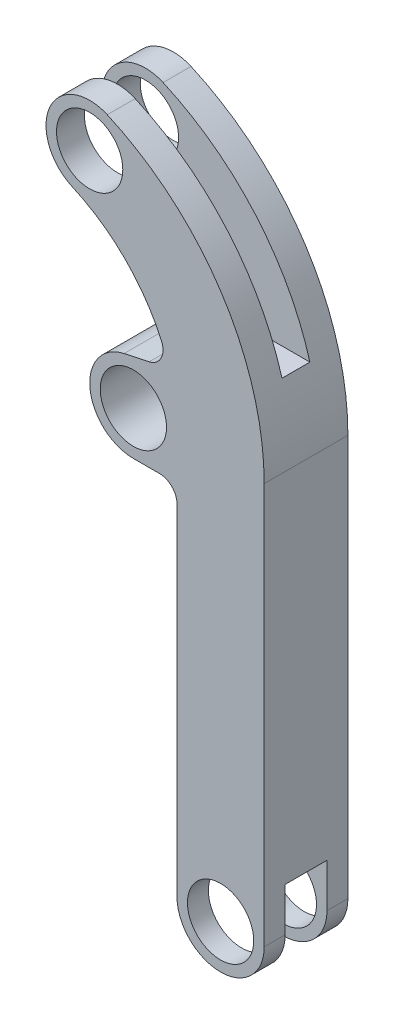
ISO-10303-21;
HEADER;
FILE_DESCRIPTION(('STEP AP214'),'2;1');
FILE_NAME('part.step','',(''),(''),'','','');
FILE_SCHEMA(('AUTOMOTIVE_DESIGN { 1 0 10303 214 1 1 1 1 }'));
ENDSEC;
DATA;
#1=APPLICATION_CONTEXT('core data for automotive mechanical design processes');
#2=APPLICATION_PROTOCOL_DEFINITION('international standard','automotive_design',2000,#1);
#3=PRODUCT_CONTEXT('',#1,'mechanical');
#4=PRODUCT('Part','Part','',(#3));
#5=PRODUCT_RELATED_PRODUCT_CATEGORY('part','',(#4));
#6=PRODUCT_DEFINITION_FORMATION('','',#4);
#7=PRODUCT_DEFINITION_CONTEXT('part definition',#1,'design');
#8=PRODUCT_DEFINITION('design','',#6,#7);
#9=PRODUCT_DEFINITION_SHAPE('','',#8);
#10=(LENGTH_UNIT() NAMED_UNIT(*) SI_UNIT(.MILLI.,.METRE.));
#11=(NAMED_UNIT(*) PLANE_ANGLE_UNIT() SI_UNIT($,.RADIAN.));
#12=(NAMED_UNIT(*) SI_UNIT($,.STERADIAN.) SOLID_ANGLE_UNIT());
#13=UNCERTAINTY_MEASURE_WITH_UNIT(LENGTH_MEASURE(1.E-05),#10,'distance_accuracy_value','');
#14=(GEOMETRIC_REPRESENTATION_CONTEXT(3) GLOBAL_UNCERTAINTY_ASSIGNED_CONTEXT((#13)) GLOBAL_UNIT_ASSIGNED_CONTEXT((#10,
#11,#12)) REPRESENTATION_CONTEXT('',''));
#15=CARTESIAN_POINT('',(0.,0.,0.));
#16=DIRECTION('',(0.,0.,1.));
#17=DIRECTION('',(1.,0.,0.));
#18=AXIS2_PLACEMENT_3D('',#15,#16,#17);
#19=CARTESIAN_POINT('',(0.,0.,24.));
#20=DIRECTION('',(0.,0.,-1.));
#21=DIRECTION('',(-1.,0.,0.));
#22=AXIS2_PLACEMENT_3D('',#19,#20,#21);
#23=CYLINDRICAL_SURFACE('',#22,12.5);
#24=DIRECTION('',(0.,0.,-1.));
#25=VECTOR('',#24,1.);
#26=CARTESIAN_POINT('',(-12.5,0.,24.));
#27=LINE('',#26,#25);
#28=CARTESIAN_POINT('',(-12.5,0.,24.));
#29=VERTEX_POINT('',#28);
#30=CARTESIAN_POINT('',(-12.5,0.,18.));
#31=VERTEX_POINT('',#30);
#32=EDGE_CURVE('E334',#29,#31,#27,.T.);
#33=ORIENTED_EDGE('',*,*,#32,.T.);
#34=CARTESIAN_POINT('',(0.,0.,18.));
#35=DIRECTION('',(0.,0.,1.));
#36=DIRECTION('',(1.,0.,0.));
#37=AXIS2_PLACEMENT_3D('',#34,#35,#36);
#38=CIRCLE('',#37,12.5);
#39=CARTESIAN_POINT('',(12.5000000016546,0.,18.));
#40=VERTEX_POINT('',#39);
#41=EDGE_CURVE('E220',#31,#40,#38,.T.);
#42=ORIENTED_EDGE('',*,*,#41,.T.);
#43=DIRECTION('',(0.,0.,-1.));
#44=VECTOR('',#43,1.);
#45=CARTESIAN_POINT('',(12.5,0.,24.));
#46=LINE('',#45,#44);
#47=CARTESIAN_POINT('',(12.5,0.,24.));
#48=VERTEX_POINT('',#47);
#49=EDGE_CURVE('E330',#48,#40,#46,.T.);
#50=ORIENTED_EDGE('',*,*,#49,.F.);
#51=CARTESIAN_POINT('',(0.,0.,24.));
#52=DIRECTION('',(0.,0.,1.));
#53=DIRECTION('',(1.,0.,0.));
#54=AXIS2_PLACEMENT_3D('',#51,#52,#53);
#55=CIRCLE('',#54,12.5);
#56=EDGE_CURVE('E275',#29,#48,#55,.T.);
#57=ORIENTED_EDGE('',*,*,#56,.F.);
#58=EDGE_LOOP('',(#33,#42,#50,#57));
#59=FACE_BOUND('',#58,.T.);
#60=ADVANCED_FACE('F35',(#59),#23,.T.);
#61=CARTESIAN_POINT('',(0.,0.,24.));
#62=DIRECTION('',(0.,0.,-1.));
#63=DIRECTION('',(-1.,0.,0.));
#64=AXIS2_PLACEMENT_3D('',#61,#62,#63);
#65=CYLINDRICAL_SURFACE('',#64,9.5);
#66=CARTESIAN_POINT('',(0.,0.,18.));
#67=DIRECTION('',(0.,0.,1.));
#68=DIRECTION('',(1.,0.,0.));
#69=AXIS2_PLACEMENT_3D('',#66,#67,#68);
#70=CIRCLE('',#69,9.5);
#71=CARTESIAN_POINT('',(9.50000000000001,0.,18.));
#72=VERTEX_POINT('',#71);
#73=EDGE_CURVE('E217',#72,#72,#70,.T.);
#74=ORIENTED_EDGE('',*,*,#73,.F.);
#75=EDGE_LOOP('',(#74));
#76=FACE_BOUND('',#75,.T.);
#77=CARTESIAN_POINT('',(0.,0.,24.));
#78=DIRECTION('',(0.,0.,1.));
#79=DIRECTION('',(1.,0.,0.));
#80=AXIS2_PLACEMENT_3D('',#77,#78,#79);
#81=CIRCLE('',#80,9.5);
#82=CARTESIAN_POINT('',(9.50000000000001,0.,24.));
#83=VERTEX_POINT('',#82);
#84=EDGE_CURVE('E282',#83,#83,#81,.T.);
#85=ORIENTED_EDGE('',*,*,#84,.T.);
#86=EDGE_LOOP('',(#85));
#87=FACE_BOUND('',#86,.T.);
#88=ADVANCED_FACE('F459',(#76,#87),#65,.F.);
#89=CARTESIAN_POINT('',(-37.5333490155316,172.653405471445,24.));
#90=DIRECTION('',(0.,0.,-1.));
#91=DIRECTION('',(-1.,0.,0.));
#92=AXIS2_PLACEMENT_3D('',#89,#90,#91);
#93=CYLINDRICAL_SURFACE('',#92,12.5);
#94=CARTESIAN_POINT('',(-37.5333490155316,172.653405471445,16.));
#95=DIRECTION('',(0.,0.,1.));
#96=DIRECTION('',(0.,-1.,0.));
#97=AXIS2_PLACEMENT_3D('',#94,#95,#96);
#98=CIRCLE('',#97,12.5);
#99=CARTESIAN_POINT('',(-32.4750796285068,184.084237060104,16.));
#100=VERTEX_POINT('',#99);
#101=CARTESIAN_POINT('',(-42.5916184025563,161.222573882786,16.));
#102=VERTEX_POINT('',#101);
#103=EDGE_CURVE('E234',#100,#102,#98,.T.);
#104=ORIENTED_EDGE('',*,*,#103,.T.);
#105=DIRECTION('',(0.,0.,-1.));
#106=VECTOR('',#105,1.);
#107=CARTESIAN_POINT('',(-42.5916184025563,161.222573882786,24.));
#108=LINE('',#107,#106);
#109=CARTESIAN_POINT('',(-42.5916184025563,161.222573882786,24.));
#110=VERTEX_POINT('',#109);
#111=EDGE_CURVE('E354',#110,#102,#108,.T.);
#112=ORIENTED_EDGE('',*,*,#111,.F.);
#113=CARTESIAN_POINT('',(-37.5333490155316,172.653405471445,24.));
#114=DIRECTION('',(0.,0.,1.));
#115=DIRECTION('',(1.,0.,0.));
#116=AXIS2_PLACEMENT_3D('',#113,#114,#115);
#117=CIRCLE('',#116,12.5);
#118=CARTESIAN_POINT('',(-32.4750796285068,184.084237060104,24.));
#119=VERTEX_POINT('',#118);
#120=EDGE_CURVE('E254',#119,#110,#117,.T.);
#121=ORIENTED_EDGE('',*,*,#120,.F.);
#122=DIRECTION('',(0.,0.,-1.));
#123=VECTOR('',#122,1.);
#124=CARTESIAN_POINT('',(-32.4750796285068,184.084237060104,24.));
#125=LINE('',#124,#123);
#126=EDGE_CURVE('E358',#119,#100,#125,.T.);
#127=ORIENTED_EDGE('',*,*,#126,.T.);
#128=EDGE_LOOP('',(#104,#112,#121,#127));
#129=FACE_BOUND('',#128,.T.);
#130=ADVANCED_FACE('F464',(#129),#93,.T.);
#131=CARTESIAN_POINT('',(-63.0453972473131,115.0005,24.));
#132=DIRECTION('',(0.,0.,-1.));
#133=DIRECTION('',(-1.,0.,0.));
#134=AXIS2_PLACEMENT_3D('',#131,#132,#133);
#135=CYLINDRICAL_SURFACE('',#134,50.5453972489678);
#136=CARTESIAN_POINT('',(-63.0453972473131,115.0005,8.00000000000001));
#137=DIRECTION('',(0.,0.,-1.));
#138=DIRECTION('',(0.,1.,0.));
#139=AXIS2_PLACEMENT_3D('',#136,#137,#138);
#140=CIRCLE('',#139,50.5453972489678);
#141=CARTESIAN_POINT('',(-42.5916184025563,161.222573882786,8.));
#142=VERTEX_POINT('',#141);
#143=CARTESIAN_POINT('',(-16.9412221405557,135.718661616838,8.00000000000001));
#144=VERTEX_POINT('',#143);
#145=EDGE_CURVE('E240',#142,#144,#140,.T.);
#146=ORIENTED_EDGE('',*,*,#145,.F.);
#147=CARTESIAN_POINT('',(-42.5916184025563,161.222573882786,0.));
#148=VERTEX_POINT('',#147);
#149=EDGE_CURVE('E352',#142,#148,#108,.T.);
#150=ORIENTED_EDGE('',*,*,#149,.T.);
#151=CARTESIAN_POINT('',(-63.0453972473131,115.0005,0.));
#152=DIRECTION('',(0.,0.,1.));
#153=DIRECTION('',(1.,0.,0.));
#154=AXIS2_PLACEMENT_3D('',#151,#152,#153);
#155=CIRCLE('',#154,50.5453972489678);
#156=CARTESIAN_POINT('',(-16.9412221405557,135.718661616838,0.));
#157=VERTEX_POINT('',#156);
#158=EDGE_CURVE('E294',#157,#148,#155,.T.);
#159=ORIENTED_EDGE('',*,*,#158,.F.);
#160=DIRECTION('',(0.,0.,-1.));
#161=VECTOR('',#160,1.);
#162=CARTESIAN_POINT('',(-16.9412221405557,135.718661616838,24.));
#163=LINE('',#162,#161);
#164=EDGE_CURVE('E348',#144,#157,#163,.T.);
#165=ORIENTED_EDGE('',*,*,#164,.F.);
#166=EDGE_LOOP('',(#146,#150,#159,#165));
#167=FACE_BOUND('',#166,.T.);
#168=ADVANCED_FACE('F431',(#167),#135,.F.);
#169=CARTESIAN_POINT('',(-37.5333490155316,172.653405471445,24.));
#170=DIRECTION('',(0.,0.,-1.));
#171=DIRECTION('',(-1.,0.,0.));
#172=AXIS2_PLACEMENT_3D('',#169,#170,#171);
#173=CYLINDRICAL_SURFACE('',#172,9.50000000000001);
#174=CARTESIAN_POINT('',(-37.5333490155316,172.653405471445,8.));
#175=DIRECTION('',(0.,0.,-1.));
#176=DIRECTION('',(0.,1.,0.));
#177=AXIS2_PLACEMENT_3D('',#174,#175,#176);
#178=CIRCLE('',#177,9.50000000000001);
#179=CARTESIAN_POINT('',(-37.5333490155316,182.153405471445,8.));
#180=VERTEX_POINT('',#179);
#181=EDGE_CURVE('E239',#180,#180,#178,.T.);
#182=ORIENTED_EDGE('',*,*,#181,.F.);
#183=EDGE_LOOP('',(#182));
#184=FACE_BOUND('',#183,.T.);
#185=CARTESIAN_POINT('',(-37.5333490155316,172.653405471445,0.));
#186=DIRECTION('',(0.,0.,1.));
#187=DIRECTION('',(1.,0.,0.));
#188=AXIS2_PLACEMENT_3D('',#185,#186,#187);
#189=CIRCLE('',#188,9.50000000000001);
#190=CARTESIAN_POINT('',(-28.0333490155316,172.653405471445,0.));
#191=VERTEX_POINT('',#190);
#192=EDGE_CURVE('E319',#191,#191,#189,.T.);
#193=ORIENTED_EDGE('',*,*,#192,.F.);
#194=EDGE_LOOP('',(#193));
#195=FACE_BOUND('',#194,.T.);
#196=ADVANCED_FACE('F542',(#184,#195),#173,.F.);
#197=CARTESIAN_POINT('',(-63.0453972473131,115.0005,24.));
#198=DIRECTION('',(0.,0.,-1.));
#199=DIRECTION('',(-1.,0.,0.));
#200=AXIS2_PLACEMENT_3D('',#197,#198,#199);
#201=CYLINDRICAL_SURFACE('',#200,75.5453972489677);
#202=CARTESIAN_POINT('',(-32.4750796285068,184.084237060104,8.));
#203=VERTEX_POINT('',#202);
#204=CARTESIAN_POINT('',(-32.4750796285068,184.084237060104,0.));
#205=VERTEX_POINT('',#204);
#206=EDGE_CURVE('E357',#203,#205,#125,.T.);
#207=ORIENTED_EDGE('',*,*,#206,.F.);
#208=CARTESIAN_POINT('',(-63.0453972473131,115.0005,8.00000000000001));
#209=DIRECTION('',(0.,0.,-1.));
#210=DIRECTION('',(0.,1.,0.));
#211=AXIS2_PLACEMENT_3D('',#208,#209,#210);
#212=CIRCLE('',#211,75.5453972489677);
#213=CARTESIAN_POINT('',(9.60351757405861,135.718661616838,8.00000000000001));
#214=VERTEX_POINT('',#213);
#215=EDGE_CURVE('E244',#203,#214,#212,.T.);
#216=ORIENTED_EDGE('',*,*,#215,.T.);
#217=DIRECTION('',(0.,0.,-1.));
#218=VECTOR('',#217,1.);
#219=CARTESIAN_POINT('',(9.60351757405861,135.718661616838,24.));
#220=LINE('',#219,#218);
#221=CARTESIAN_POINT('',(9.60351757405861,135.718661616838,16.));
#222=VERTEX_POINT('',#221);
#223=EDGE_CURVE('E247',#214,#222,#220,.F.);
#224=ORIENTED_EDGE('',*,*,#223,.T.);
#225=CARTESIAN_POINT('',(-63.0453972473131,115.0005,16.));
#226=DIRECTION('',(0.,0.,1.));
#227=DIRECTION('',(0.,-1.,0.));
#228=AXIS2_PLACEMENT_3D('',#225,#226,#227);
#229=CIRCLE('',#228,75.5453972489677);
#230=EDGE_CURVE('E236',#222,#100,#229,.T.);
#231=ORIENTED_EDGE('',*,*,#230,.T.);
#232=ORIENTED_EDGE('',*,*,#126,.F.);
#233=CARTESIAN_POINT('',(-63.0453972473131,115.0005,24.));
#234=DIRECTION('',(0.,0.,1.));
#235=DIRECTION('',(1.,0.,0.));
#236=AXIS2_PLACEMENT_3D('',#233,#234,#235);
#237=CIRCLE('',#236,75.5453972489677);
#238=CARTESIAN_POINT('',(12.5,115.,24.));
#239=VERTEX_POINT('',#238);
#240=EDGE_CURVE('E251',#239,#119,#237,.T.);
#241=ORIENTED_EDGE('',*,*,#240,.F.);
#242=DIRECTION('',(0.,0.,-1.));
#243=VECTOR('',#242,1.);
#244=CARTESIAN_POINT('',(12.5,115.,24.));
#245=LINE('',#244,#243);
#246=CARTESIAN_POINT('',(12.5,115.,0.));
#247=VERTEX_POINT('',#246);
#248=EDGE_CURVE('E288',#239,#247,#245,.T.);
#249=ORIENTED_EDGE('',*,*,#248,.T.);
#250=CARTESIAN_POINT('',(-63.0453972473131,115.0005,0.));
#251=DIRECTION('',(0.,0.,1.));
#252=DIRECTION('',(1.,0.,0.));
#253=AXIS2_PLACEMENT_3D('',#250,#251,#252);
#254=CIRCLE('',#253,75.5453972489677);
#255=EDGE_CURVE('E250',#247,#205,#254,.T.);
#256=ORIENTED_EDGE('',*,*,#255,.T.);
#257=EDGE_LOOP('',(#207,#216,#224,#231,#232,#241,#249,#256));
#258=FACE_BOUND('',#257,.T.);
#259=ADVANCED_FACE('F37',(#258),#201,.T.);
#260=ORIENTED_EDGE('',*,*,#149,.F.);
#261=CARTESIAN_POINT('',(-37.5333490155316,172.653405471445,8.));
#262=DIRECTION('',(0.,0.,-1.));
#263=DIRECTION('',(0.,1.,0.));
#264=AXIS2_PLACEMENT_3D('',#261,#262,#263);
#265=CIRCLE('',#264,12.5);
#266=EDGE_CURVE('E242',#142,#203,#265,.T.);
#267=ORIENTED_EDGE('',*,*,#266,.T.);
#268=ORIENTED_EDGE('',*,*,#206,.T.);
#269=CARTESIAN_POINT('',(-37.5333490155316,172.653405471445,0.));
#270=DIRECTION('',(0.,0.,1.));
#271=DIRECTION('',(1.,0.,0.));
#272=AXIS2_PLACEMENT_3D('',#269,#270,#271);
#273=CIRCLE('',#272,12.5);
#274=EDGE_CURVE('E291',#205,#148,#273,.T.);
#275=ORIENTED_EDGE('',*,*,#274,.T.);
#276=EDGE_LOOP('',(#260,#267,#268,#275));
#277=FACE_BOUND('',#276,.T.);
#278=ADVANCED_FACE('F435',(#277),#93,.T.);
#279=CARTESIAN_POINT('',(-63.0453972473131,115.0005,16.));
#280=DIRECTION('',(0.,0.,1.));
#281=DIRECTION('',(0.,-1.,0.));
#282=AXIS2_PLACEMENT_3D('',#279,#280,#281);
#283=CIRCLE('',#282,50.5453972489678);
#284=CARTESIAN_POINT('',(-16.9412221405557,135.718661616838,16.));
#285=VERTEX_POINT('',#284);
#286=EDGE_CURVE('E231',#285,#102,#283,.T.);
#287=ORIENTED_EDGE('',*,*,#286,.F.);
#288=CARTESIAN_POINT('',(-16.9412221405557,135.718661616838,24.));
#289=VERTEX_POINT('',#288);
#290=EDGE_CURVE('E349',#289,#285,#163,.T.);
#291=ORIENTED_EDGE('',*,*,#290,.F.);
#292=CARTESIAN_POINT('',(-63.0453972473131,115.0005,24.));
#293=DIRECTION('',(0.,0.,1.));
#294=DIRECTION('',(1.,0.,0.));
#295=AXIS2_PLACEMENT_3D('',#292,#293,#294);
#296=CIRCLE('',#295,50.5453972489678);
#297=EDGE_CURVE('E257',#289,#110,#296,.T.);
#298=ORIENTED_EDGE('',*,*,#297,.T.);
#299=ORIENTED_EDGE('',*,*,#111,.T.);
#300=EDGE_LOOP('',(#287,#291,#298,#299));
#301=FACE_BOUND('',#300,.T.);
#302=ADVANCED_FACE('F447',(#301),#135,.F.);
#303=CARTESIAN_POINT('',(-21.5018921140911,133.669200860323,24.));
#304=DIRECTION('',(0.,0.,-1.));
#305=DIRECTION('',(-1.,0.,0.));
#306=AXIS2_PLACEMENT_3D('',#303,#304,#305);
#307=CYLINDRICAL_SURFACE('',#306,5.00000000000001);
#308=CARTESIAN_POINT('',(-21.5018921140911,133.669200860323,0.));
#309=DIRECTION('',(0.,0.,1.));
#310=DIRECTION('',(1.,0.,0.));
#311=AXIS2_PLACEMENT_3D('',#308,#309,#310);
#312=CIRCLE('',#311,5.00000000000001);
#313=CARTESIAN_POINT('',(-20.4397438924359,128.783319040709,0.));
#314=VERTEX_POINT('',#313);
#315=EDGE_CURVE('E297',#157,#314,#312,.F.);
#316=ORIENTED_EDGE('',*,*,#315,.T.);
#317=DIRECTION('',(0.,0.,-1.));
#318=VECTOR('',#317,1.);
#319=CARTESIAN_POINT('',(-20.4397438924359,128.783319040709,24.));
#320=LINE('',#319,#318);
#321=CARTESIAN_POINT('',(-20.4397438924359,128.783319040709,24.));
#322=VERTEX_POINT('',#321);
#323=EDGE_CURVE('E346',#322,#314,#320,.T.);
#324=ORIENTED_EDGE('',*,*,#323,.F.);
#325=CARTESIAN_POINT('',(-21.5018921140911,133.669200860323,24.));
#326=DIRECTION('',(0.,0.,1.));
#327=DIRECTION('',(1.,0.,0.));
#328=AXIS2_PLACEMENT_3D('',#325,#326,#327);
#329=CIRCLE('',#328,5.00000000000001);
#330=EDGE_CURVE('E260',#289,#322,#329,.F.);
#331=ORIENTED_EDGE('',*,*,#330,.F.);
#332=ORIENTED_EDGE('',*,*,#290,.T.);
#333=EDGE_CURVE('E353',#285,#144,#163,.T.);
#334=ORIENTED_EDGE('',*,*,#333,.T.);
#335=ORIENTED_EDGE('',*,*,#164,.T.);
#336=EDGE_LOOP('',(#316,#324,#331,#332,#334,#335));
#337=FACE_BOUND('',#336,.T.);
#338=ADVANCED_FACE('F449',(#337),#307,.F.);
#339=CARTESIAN_POINT('',(-27.6553705541378,127.214704549035,24.));
#340=DIRECTION('',(-0.212429644331042,0.977176363922801,0.));
#341=DIRECTION('',(-0.977176363922801,-0.212429644331042,0.));
#342=AXIS2_PLACEMENT_3D('',#339,#340,#341);
#343=PLANE('',#342);
#344=DIRECTION('',(0.977176363922801,0.212429644331042,0.));
#345=VECTOR('',#344,1.);
#346=CARTESIAN_POINT('',(-27.6553705541378,127.214704549035,0.));
#347=LINE('',#346,#345);
#348=CARTESIAN_POINT('',(-27.655370554138,127.214704549035,0.));
#349=VERTEX_POINT('',#348);
#350=EDGE_CURVE('E300',#349,#314,#347,.T.);
#351=ORIENTED_EDGE('',*,*,#350,.F.);
#352=DIRECTION('',(0.,0.,-1.));
#353=VECTOR('',#352,1.);
#354=CARTESIAN_POINT('',(-27.655370554138,127.214704549035,24.));
#355=LINE('',#354,#353);
#356=CARTESIAN_POINT('',(-27.655370554138,127.214704549035,24.));
#357=VERTEX_POINT('',#356);
#358=EDGE_CURVE('E344',#357,#349,#355,.T.);
#359=ORIENTED_EDGE('',*,*,#358,.F.);
#360=DIRECTION('',(0.977176363922801,0.212429644331042,0.));
#361=VECTOR('',#360,1.);
#362=CARTESIAN_POINT('',(-27.6553705541378,127.214704549035,24.));
#363=LINE('',#362,#361);
#364=EDGE_CURVE('E262',#357,#322,#363,.T.);
#365=ORIENTED_EDGE('',*,*,#364,.T.);
#366=ORIENTED_EDGE('',*,*,#323,.T.);
#367=EDGE_LOOP('',(#351,#359,#365,#366));
#368=FACE_BOUND('',#367,.T.);
#369=ADVANCED_FACE('F423',(#368),#343,.T.);
#370=CARTESIAN_POINT('',(-25.,115.,24.));
#371=DIRECTION('',(0.,0.,-1.));
#372=DIRECTION('',(-1.,0.,0.));
#373=AXIS2_PLACEMENT_3D('',#370,#371,#372);
#374=CYLINDRICAL_SURFACE('',#373,12.5);
#375=DIRECTION('',(0.,0.,-1.));
#376=VECTOR('',#375,1.);
#377=CARTESIAN_POINT('',(-35.5,108.217670016875,24.));
#378=LINE('',#377,#376);
#379=CARTESIAN_POINT('',(-35.5,108.217670016875,16.));
#380=VERTEX_POINT('',#379);
#381=CARTESIAN_POINT('',(-35.5,108.217670016875,8.));
#382=VERTEX_POINT('',#381);
#383=EDGE_CURVE('E186',#380,#382,#378,.T.);
#384=ORIENTED_EDGE('',*,*,#383,.T.);
#385=CARTESIAN_POINT('',(-25.,115.,8.));
#386=DIRECTION('',(0.,0.,-1.));
#387=DIRECTION('',(-1.,0.,0.));
#388=AXIS2_PLACEMENT_3D('',#385,#386,#387);
#389=CIRCLE('',#388,12.5);
#390=CARTESIAN_POINT('',(-35.5,121.782329983125,8.));
#391=VERTEX_POINT('',#390);
#392=EDGE_CURVE('E11',#382,#391,#389,.T.);
#393=ORIENTED_EDGE('',*,*,#392,.T.);
#394=DIRECTION('',(0.,0.,-1.));
#395=VECTOR('',#394,1.);
#396=CARTESIAN_POINT('',(-35.5,121.782329983125,24.));
#397=LINE('',#396,#395);
#398=CARTESIAN_POINT('',(-35.5,121.782329983125,16.));
#399=VERTEX_POINT('',#398);
#400=EDGE_CURVE('E188',#391,#399,#397,.F.);
#401=ORIENTED_EDGE('',*,*,#400,.T.);
#402=CARTESIAN_POINT('',(-25.,115.,16.));
#403=DIRECTION('',(0.,0.,1.));
#404=DIRECTION('',(1.,0.,0.));
#405=AXIS2_PLACEMENT_3D('',#402,#403,#404);
#406=CIRCLE('',#405,12.5);
#407=EDGE_CURVE('E192',#399,#380,#406,.T.);
#408=ORIENTED_EDGE('',*,*,#407,.T.);
#409=EDGE_LOOP('',(#384,#393,#401,#408));
#410=FACE_BOUND('',#409,.T.);
#411=CARTESIAN_POINT('',(-25.,115.,0.));
#412=DIRECTION('',(0.,0.,1.));
#413=DIRECTION('',(1.,0.,0.));
#414=AXIS2_PLACEMENT_3D('',#411,#412,#413);
#415=CIRCLE('',#414,12.5);
#416=CARTESIAN_POINT('',(-25.,102.5,0.));
#417=VERTEX_POINT('',#416);
#418=EDGE_CURVE('E303',#349,#417,#415,.T.);
#419=ORIENTED_EDGE('',*,*,#418,.T.);
#420=DIRECTION('',(0.,0.,-1.));
#421=VECTOR('',#420,1.);
#422=CARTESIAN_POINT('',(-25.,102.5,24.));
#423=LINE('',#422,#421);
#424=CARTESIAN_POINT('',(-25.,102.5,24.));
#425=VERTEX_POINT('',#424);
#426=EDGE_CURVE('E341',#425,#417,#423,.T.);
#427=ORIENTED_EDGE('',*,*,#426,.F.);
#428=CARTESIAN_POINT('',(-25.,115.,24.));
#429=DIRECTION('',(0.,0.,1.));
#430=DIRECTION('',(1.,0.,0.));
#431=AXIS2_PLACEMENT_3D('',#428,#429,#430);
#432=CIRCLE('',#431,12.5);
#433=EDGE_CURVE('E265',#357,#425,#432,.T.);
#434=ORIENTED_EDGE('',*,*,#433,.F.);
#435=ORIENTED_EDGE('',*,*,#358,.T.);
#436=EDGE_LOOP('',(#419,#427,#434,#435));
#437=FACE_BOUND('',#436,.T.);
#438=ADVANCED_FACE('F190',(#410,#437),#374,.T.);
#439=CARTESIAN_POINT('',(0.,102.5,24.));
#440=DIRECTION('',(0.,1.,0.));
#441=DIRECTION('',(0.,0.,1.));
#442=AXIS2_PLACEMENT_3D('',#439,#440,#441);
#443=PLANE('',#442);
#444=DIRECTION('',(1.,0.,0.));
#445=VECTOR('',#444,1.);
#446=CARTESIAN_POINT('',(0.,102.5,0.));
#447=LINE('',#446,#445);
#448=CARTESIAN_POINT('',(-17.5,102.5,0.));
#449=VERTEX_POINT('',#448);
#450=EDGE_CURVE('E305',#417,#449,#447,.T.);
#451=ORIENTED_EDGE('',*,*,#450,.T.);
#452=DIRECTION('',(0.,0.,-1.));
#453=VECTOR('',#452,1.);
#454=CARTESIAN_POINT('',(-17.5,102.5,24.));
#455=LINE('',#454,#453);
#456=CARTESIAN_POINT('',(-17.5,102.5,24.));
#457=VERTEX_POINT('',#456);
#458=EDGE_CURVE('E339',#457,#449,#455,.T.);
#459=ORIENTED_EDGE('',*,*,#458,.F.);
#460=DIRECTION('',(1.,0.,0.));
#461=VECTOR('',#460,1.);
#462=CARTESIAN_POINT('',(0.,102.5,24.));
#463=LINE('',#462,#461);
#464=EDGE_CURVE('E267',#425,#457,#463,.T.);
#465=ORIENTED_EDGE('',*,*,#464,.F.);
#466=ORIENTED_EDGE('',*,*,#426,.T.);
#467=EDGE_LOOP('',(#451,#459,#465,#466));
#468=FACE_BOUND('',#467,.T.);
#469=ADVANCED_FACE('F417',(#468),#443,.F.);
#470=CARTESIAN_POINT('',(-17.5,97.5,24.));
#471=DIRECTION('',(0.,0.,-1.));
#472=DIRECTION('',(-1.,0.,0.));
#473=AXIS2_PLACEMENT_3D('',#470,#471,#472);
#474=CYLINDRICAL_SURFACE('',#473,5.);
#475=CARTESIAN_POINT('',(-17.5,97.5,0.));
#476=DIRECTION('',(0.,0.,1.));
#477=DIRECTION('',(1.,0.,0.));
#478=AXIS2_PLACEMENT_3D('',#475,#476,#477);
#479=CIRCLE('',#478,5.);
#480=CARTESIAN_POINT('',(-12.5,97.5,0.));
#481=VERTEX_POINT('',#480);
#482=EDGE_CURVE('E308',#481,#449,#479,.T.);
#483=ORIENTED_EDGE('',*,*,#482,.F.);
#484=DIRECTION('',(0.,0.,-1.));
#485=VECTOR('',#484,1.);
#486=CARTESIAN_POINT('',(-12.5,97.5,24.));
#487=LINE('',#486,#485);
#488=CARTESIAN_POINT('',(-12.5,97.5,24.));
#489=VERTEX_POINT('',#488);
#490=EDGE_CURVE('E337',#489,#481,#487,.T.);
#491=ORIENTED_EDGE('',*,*,#490,.F.);
#492=CARTESIAN_POINT('',(-17.5,97.5,24.));
#493=DIRECTION('',(0.,0.,1.));
#494=DIRECTION('',(1.,0.,0.));
#495=AXIS2_PLACEMENT_3D('',#492,#493,#494);
#496=CIRCLE('',#495,5.);
#497=EDGE_CURVE('E269',#489,#457,#496,.T.);
#498=ORIENTED_EDGE('',*,*,#497,.T.);
#499=ORIENTED_EDGE('',*,*,#458,.T.);
#500=EDGE_LOOP('',(#483,#491,#498,#499));
#501=FACE_BOUND('',#500,.T.);
#502=ADVANCED_FACE('F411',(#501),#474,.F.);
#503=CARTESIAN_POINT('',(-12.5,0.,24.));
#504=DIRECTION('',(-1.,0.,0.));
#505=DIRECTION('',(0.,0.,1.));
#506=AXIS2_PLACEMENT_3D('',#503,#504,#505);
#507=PLANE('',#506);
#508=DIRECTION('',(0.,1.,0.));
#509=VECTOR('',#508,1.);
#510=CARTESIAN_POINT('',(-12.5,0.,18.));
#511=LINE('',#510,#509);
#512=CARTESIAN_POINT('',(-12.5,12.5,18.));
#513=VERTEX_POINT('',#512);
#514=EDGE_CURVE('E222',#31,#513,#511,.T.);
#515=ORIENTED_EDGE('',*,*,#514,.F.);
#516=ORIENTED_EDGE('',*,*,#32,.F.);
#517=DIRECTION('',(0.,1.,0.));
#518=VECTOR('',#517,1.);
#519=CARTESIAN_POINT('',(-12.5,0.,24.));
#520=LINE('',#519,#518);
#521=EDGE_CURVE('E272',#29,#489,#520,.T.);
#522=ORIENTED_EDGE('',*,*,#521,.T.);
#523=ORIENTED_EDGE('',*,*,#490,.T.);
#524=DIRECTION('',(0.,1.,0.));
#525=VECTOR('',#524,1.);
#526=CARTESIAN_POINT('',(-12.5,0.,0.));
#527=LINE('',#526,#525);
#528=CARTESIAN_POINT('',(-12.5,0.,0.));
#529=VERTEX_POINT('',#528);
#530=EDGE_CURVE('E311',#529,#481,#527,.T.);
#531=ORIENTED_EDGE('',*,*,#530,.F.);
#532=CARTESIAN_POINT('',(-12.5,0.,6.));
#533=VERTEX_POINT('',#532);
#534=EDGE_CURVE('E333',#533,#529,#27,.T.);
#535=ORIENTED_EDGE('',*,*,#534,.F.);
#536=DIRECTION('',(0.,-1.,0.));
#537=VECTOR('',#536,1.);
#538=CARTESIAN_POINT('',(-12.5,0.,6.));
#539=LINE('',#538,#537);
#540=CARTESIAN_POINT('',(-12.5,12.5,6.));
#541=VERTEX_POINT('',#540);
#542=EDGE_CURVE('E214',#541,#533,#539,.T.);
#543=ORIENTED_EDGE('',*,*,#542,.F.);
#544=DIRECTION('',(0.,0.,-1.));
#545=VECTOR('',#544,1.);
#546=CARTESIAN_POINT('',(-12.5,12.5,24.));
#547=LINE('',#546,#545);
#548=EDGE_CURVE('E205',#513,#541,#547,.T.);
#549=ORIENTED_EDGE('',*,*,#548,.F.);
#550=EDGE_LOOP('',(#515,#516,#522,#523,#531,#535,#543,#549));
#551=FACE_BOUND('',#550,.T.);
#552=ADVANCED_FACE('F383',(#551),#507,.T.);
#553=CARTESIAN_POINT('',(12.5000000016546,0.,6.));
#554=VERTEX_POINT('',#553);
#555=CARTESIAN_POINT('',(12.5,0.,0.));
#556=VERTEX_POINT('',#555);
#557=EDGE_CURVE('E329',#554,#556,#46,.T.);
#558=ORIENTED_EDGE('',*,*,#557,.F.);
#559=CARTESIAN_POINT('',(0.,0.,6.));
#560=DIRECTION('',(0.,0.,-1.));
#561=DIRECTION('',(-1.,0.,0.));
#562=AXIS2_PLACEMENT_3D('',#559,#560,#561);
#563=CIRCLE('',#562,12.5);
#564=EDGE_CURVE('E212',#554,#533,#563,.T.);
#565=ORIENTED_EDGE('',*,*,#564,.T.);
#566=ORIENTED_EDGE('',*,*,#534,.T.);
#567=CARTESIAN_POINT('',(0.,0.,0.));
#568=DIRECTION('',(0.,0.,1.));
#569=DIRECTION('',(1.,0.,0.));
#570=AXIS2_PLACEMENT_3D('',#567,#568,#569);
#571=CIRCLE('',#570,12.5);
#572=EDGE_CURVE('E314',#529,#556,#571,.T.);
#573=ORIENTED_EDGE('',*,*,#572,.T.);
#574=EDGE_LOOP('',(#558,#565,#566,#573));
#575=FACE_BOUND('',#574,.T.);
#576=ADVANCED_FACE('F388',(#575),#23,.T.);
#577=CARTESIAN_POINT('',(0.,0.,6.));
#578=DIRECTION('',(0.,0.,-1.));
#579=DIRECTION('',(-1.,0.,0.));
#580=AXIS2_PLACEMENT_3D('',#577,#578,#579);
#581=CIRCLE('',#580,9.5);
#582=CARTESIAN_POINT('',(-9.49999999999999,0.,6.));
#583=VERTEX_POINT('',#582);
#584=EDGE_CURVE('E209',#583,#583,#581,.T.);
#585=ORIENTED_EDGE('',*,*,#584,.F.);
#586=EDGE_LOOP('',(#585));
#587=FACE_BOUND('',#586,.T.);
#588=CARTESIAN_POINT('',(0.,0.,0.));
#589=DIRECTION('',(0.,0.,1.));
#590=DIRECTION('',(1.,0.,0.));
#591=AXIS2_PLACEMENT_3D('',#588,#589,#590);
#592=CIRCLE('',#591,9.5);
#593=CARTESIAN_POINT('',(9.50000000000001,0.,0.));
#594=VERTEX_POINT('',#593);
#595=EDGE_CURVE('E322',#594,#594,#592,.T.);
#596=ORIENTED_EDGE('',*,*,#595,.F.);
#597=EDGE_LOOP('',(#596));
#598=FACE_BOUND('',#597,.T.);
#599=ADVANCED_FACE('F467',(#587,#598),#65,.F.);
#600=CARTESIAN_POINT('',(-37.5333490155316,172.653405471445,16.));
#601=DIRECTION('',(0.,0.,1.));
#602=DIRECTION('',(0.,-1.,0.));
#603=AXIS2_PLACEMENT_3D('',#600,#601,#602);
#604=CIRCLE('',#603,9.50000000000001);
#605=CARTESIAN_POINT('',(-37.5333490155316,163.153405471445,16.));
#606=VERTEX_POINT('',#605);
#607=EDGE_CURVE('E228',#606,#606,#604,.T.);
#608=ORIENTED_EDGE('',*,*,#607,.F.);
#609=EDGE_LOOP('',(#608));
#610=FACE_BOUND('',#609,.T.);
#611=CARTESIAN_POINT('',(-37.5333490155316,172.653405471445,24.));
#612=DIRECTION('',(0.,0.,1.));
#613=DIRECTION('',(1.,0.,0.));
#614=AXIS2_PLACEMENT_3D('',#611,#612,#613);
#615=CIRCLE('',#614,9.50000000000001);
#616=CARTESIAN_POINT('',(-28.0333490155316,172.653405471445,24.));
#617=VERTEX_POINT('',#616);
#618=EDGE_CURVE('E279',#617,#617,#615,.T.);
#619=ORIENTED_EDGE('',*,*,#618,.T.);
#620=EDGE_LOOP('',(#619));
#621=FACE_BOUND('',#620,.T.);
#622=ADVANCED_FACE('F475',(#610,#621),#173,.F.);
#623=CARTESIAN_POINT('',(12.5,0.,24.));
#624=DIRECTION('',(-1.,0.,0.));
#625=DIRECTION('',(0.,-1.,0.));
#626=AXIS2_PLACEMENT_3D('',#623,#624,#625);
#627=PLANE('',#626);
#628=ORIENTED_EDGE('',*,*,#49,.T.);
#629=DIRECTION('',(0.,1.,0.));
#630=VECTOR('',#629,1.);
#631=CARTESIAN_POINT('',(12.5,0.,18.));
#632=LINE('',#631,#630);
#633=CARTESIAN_POINT('',(12.5000000016546,12.5,18.));
#634=VERTEX_POINT('',#633);
#635=EDGE_CURVE('E43',#40,#634,#632,.T.);
#636=ORIENTED_EDGE('',*,*,#635,.T.);
#637=DIRECTION('',(0.,0.,-1.));
#638=VECTOR('',#637,1.);
#639=CARTESIAN_POINT('',(12.5000000016546,12.5,18.));
#640=LINE('',#639,#638);
#641=CARTESIAN_POINT('',(12.5,12.5,6.00000000000001));
#642=VERTEX_POINT('',#641);
#643=EDGE_CURVE('E194',#634,#642,#640,.T.);
#644=ORIENTED_EDGE('',*,*,#643,.T.);
#645=DIRECTION('',(0.,-1.,0.));
#646=VECTOR('',#645,1.);
#647=CARTESIAN_POINT('',(12.5000000016546,-12.5,6.));
#648=LINE('',#647,#646);
#649=EDGE_CURVE('E57',#642,#554,#648,.T.);
#650=ORIENTED_EDGE('',*,*,#649,.T.);
#651=ORIENTED_EDGE('',*,*,#557,.T.);
#652=DIRECTION('',(0.,1.,0.));
#653=VECTOR('',#652,1.);
#654=CARTESIAN_POINT('',(12.5,0.,0.));
#655=LINE('',#654,#653);
#656=EDGE_CURVE('E317',#556,#247,#655,.T.);
#657=ORIENTED_EDGE('',*,*,#656,.T.);
#658=ORIENTED_EDGE('',*,*,#248,.F.);
#659=DIRECTION('',(0.,1.,0.));
#660=VECTOR('',#659,1.);
#661=CARTESIAN_POINT('',(12.5,0.,24.));
#662=LINE('',#661,#660);
#663=EDGE_CURVE('E277',#48,#239,#662,.T.);
#664=ORIENTED_EDGE('',*,*,#663,.F.);
#665=EDGE_LOOP('',(#628,#636,#644,#650,#651,#657,#658,#664));
#666=FACE_BOUND('',#665,.T.);
#667=ADVANCED_FACE('F367',(#666),#627,.F.);
#668=CARTESIAN_POINT('',(-25.,115.,24.));
#669=DIRECTION('',(0.,0.,-1.));
#670=DIRECTION('',(-1.,0.,0.));
#671=AXIS2_PLACEMENT_3D('',#668,#669,#670);
#672=CYLINDRICAL_SURFACE('',#671,9.5);
#673=CARTESIAN_POINT('',(-25.,115.,24.));
#674=DIRECTION('',(0.,0.,1.));
#675=DIRECTION('',(1.,0.,0.));
#676=AXIS2_PLACEMENT_3D('',#673,#674,#675);
#677=CIRCLE('',#676,9.5);
#678=CARTESIAN_POINT('',(-15.5,115.,24.));
#679=VERTEX_POINT('',#678);
#680=EDGE_CURVE('E285',#679,#679,#677,.T.);
#681=ORIENTED_EDGE('',*,*,#680,.T.);
#682=EDGE_LOOP('',(#681));
#683=FACE_BOUND('',#682,.T.);
#684=CARTESIAN_POINT('',(-25.,115.,0.));
#685=DIRECTION('',(0.,0.,1.));
#686=DIRECTION('',(1.,0.,0.));
#687=AXIS2_PLACEMENT_3D('',#684,#685,#686);
#688=CIRCLE('',#687,9.5);
#689=CARTESIAN_POINT('',(-15.5,115.,0.));
#690=VERTEX_POINT('',#689);
#691=EDGE_CURVE('E255',#690,#690,#688,.T.);
#692=ORIENTED_EDGE('',*,*,#691,.F.);
#693=EDGE_LOOP('',(#692));
#694=FACE_BOUND('',#693,.T.);
#695=ADVANCED_FACE('F505',(#683,#694),#672,.F.);
#696=CARTESIAN_POINT('',(0.,0.,24.));
#697=DIRECTION('',(0.,0.,1.));
#698=DIRECTION('',(1.,0.,0.));
#699=AXIS2_PLACEMENT_3D('',#696,#697,#698);
#700=PLANE('',#699);
#701=ORIENTED_EDGE('',*,*,#240,.T.);
#702=ORIENTED_EDGE('',*,*,#120,.T.);
#703=ORIENTED_EDGE('',*,*,#297,.F.);
#704=ORIENTED_EDGE('',*,*,#330,.T.);
#705=ORIENTED_EDGE('',*,*,#364,.F.);
#706=ORIENTED_EDGE('',*,*,#433,.T.);
#707=ORIENTED_EDGE('',*,*,#464,.T.);
#708=ORIENTED_EDGE('',*,*,#497,.F.);
#709=ORIENTED_EDGE('',*,*,#521,.F.);
#710=ORIENTED_EDGE('',*,*,#56,.T.);
#711=ORIENTED_EDGE('',*,*,#663,.T.);
#712=EDGE_LOOP('',(#701,#702,#703,#704,#705,#706,#707,#708,#709,#710,#711));
#713=FACE_BOUND('',#712,.T.);
#714=ORIENTED_EDGE('',*,*,#618,.F.);
#715=EDGE_LOOP('',(#714));
#716=FACE_BOUND('',#715,.T.);
#717=ORIENTED_EDGE('',*,*,#84,.F.);
#718=EDGE_LOOP('',(#717));
#719=FACE_BOUND('',#718,.T.);
#720=ORIENTED_EDGE('',*,*,#680,.F.);
#721=EDGE_LOOP('',(#720));
#722=FACE_BOUND('',#721,.T.);
#723=ADVANCED_FACE('F401',(#713,#716,#719,#722),#700,.T.);
#724=CARTESIAN_POINT('',(0.,0.,0.));
#725=DIRECTION('',(0.,0.,1.));
#726=DIRECTION('',(1.,0.,0.));
#727=AXIS2_PLACEMENT_3D('',#724,#725,#726);
#728=PLANE('',#727);
#729=ORIENTED_EDGE('',*,*,#255,.F.);
#730=ORIENTED_EDGE('',*,*,#656,.F.);
#731=ORIENTED_EDGE('',*,*,#572,.F.);
#732=ORIENTED_EDGE('',*,*,#530,.T.);
#733=ORIENTED_EDGE('',*,*,#482,.T.);
#734=ORIENTED_EDGE('',*,*,#450,.F.);
#735=ORIENTED_EDGE('',*,*,#418,.F.);
#736=ORIENTED_EDGE('',*,*,#350,.T.);
#737=ORIENTED_EDGE('',*,*,#315,.F.);
#738=ORIENTED_EDGE('',*,*,#158,.T.);
#739=ORIENTED_EDGE('',*,*,#274,.F.);
#740=EDGE_LOOP('',(#729,#730,#731,#732,#733,#734,#735,#736,#737,#738,#739));
#741=FACE_BOUND('',#740,.T.);
#742=ORIENTED_EDGE('',*,*,#192,.T.);
#743=EDGE_LOOP('',(#742));
#744=FACE_BOUND('',#743,.T.);
#745=ORIENTED_EDGE('',*,*,#595,.T.);
#746=EDGE_LOOP('',(#745));
#747=FACE_BOUND('',#746,.T.);
#748=ORIENTED_EDGE('',*,*,#691,.T.);
#749=EDGE_LOOP('',(#748));
#750=FACE_BOUND('',#749,.T.);
#751=ADVANCED_FACE('F392',(#741,#744,#747,#750),#728,.F.);
#752=CARTESIAN_POINT('',(12.5000000016546,135.718661616838,8.00000000000001));
#753=DIRECTION('',(0.,-1.,0.));
#754=DIRECTION('',(0.,0.,-1.));
#755=AXIS2_PLACEMENT_3D('',#752,#753,#754);
#756=PLANE('',#755);
#757=DIRECTION('',(-1.,0.,0.));
#758=VECTOR('',#757,1.);
#759=CARTESIAN_POINT('',(12.5000000016546,135.718661616838,8.00000000000001));
#760=LINE('',#759,#758);
#761=EDGE_CURVE('E224',#214,#144,#760,.T.);
#762=ORIENTED_EDGE('',*,*,#761,.T.);
#763=ORIENTED_EDGE('',*,*,#333,.F.);
#764=DIRECTION('',(-1.,0.,0.));
#765=VECTOR('',#764,1.);
#766=CARTESIAN_POINT('',(12.5000000016546,135.718661616838,16.));
#767=LINE('',#766,#765);
#768=EDGE_CURVE('E225',#222,#285,#767,.T.);
#769=ORIENTED_EDGE('',*,*,#768,.F.);
#770=ORIENTED_EDGE('',*,*,#223,.F.);
#771=EDGE_LOOP('',(#762,#763,#769,#770));
#772=FACE_BOUND('',#771,.T.);
#773=ADVANCED_FACE('F441',(#772),#756,.F.);
#774=CARTESIAN_POINT('',(12.5000000016546,185.153405471445,8.));
#775=DIRECTION('',(0.,0.,-1.));
#776=DIRECTION('',(0.,1.,0.));
#777=AXIS2_PLACEMENT_3D('',#774,#775,#776);
#778=PLANE('',#777);
#779=ORIENTED_EDGE('',*,*,#181,.T.);
#780=EDGE_LOOP('',(#779));
#781=FACE_BOUND('',#780,.T.);
#782=ORIENTED_EDGE('',*,*,#215,.F.);
#783=ORIENTED_EDGE('',*,*,#266,.F.);
#784=ORIENTED_EDGE('',*,*,#145,.T.);
#785=ORIENTED_EDGE('',*,*,#761,.F.);
#786=EDGE_LOOP('',(#782,#783,#784,#785));
#787=FACE_BOUND('',#786,.T.);
#788=ADVANCED_FACE('F439',(#781,#787),#778,.F.);
#789=CARTESIAN_POINT('',(12.5000000016546,185.153405471445,16.));
#790=DIRECTION('',(0.,0.,1.));
#791=DIRECTION('',(0.,-1.,0.));
#792=AXIS2_PLACEMENT_3D('',#789,#790,#791);
#793=PLANE('',#792);
#794=ORIENTED_EDGE('',*,*,#607,.T.);
#795=EDGE_LOOP('',(#794));
#796=FACE_BOUND('',#795,.T.);
#797=ORIENTED_EDGE('',*,*,#286,.T.);
#798=ORIENTED_EDGE('',*,*,#103,.F.);
#799=ORIENTED_EDGE('',*,*,#230,.F.);
#800=ORIENTED_EDGE('',*,*,#768,.T.);
#801=EDGE_LOOP('',(#797,#798,#799,#800));
#802=FACE_BOUND('',#801,.T.);
#803=ADVANCED_FACE('F445',(#796,#802),#793,.F.);
#804=CARTESIAN_POINT('',(12.5000000016546,-12.5,18.));
#805=DIRECTION('',(0.,0.,1.));
#806=DIRECTION('',(1.,0.,0.));
#807=AXIS2_PLACEMENT_3D('',#804,#805,#806);
#808=PLANE('',#807);
#809=ORIENTED_EDGE('',*,*,#514,.T.);
#810=DIRECTION('',(-1.,0.,0.));
#811=VECTOR('',#810,1.);
#812=CARTESIAN_POINT('',(12.5000000016546,12.5,18.));
#813=LINE('',#812,#811);
#814=EDGE_CURVE('E202',#634,#513,#813,.T.);
#815=ORIENTED_EDGE('',*,*,#814,.F.);
#816=ORIENTED_EDGE('',*,*,#635,.F.);
#817=ORIENTED_EDGE('',*,*,#41,.F.);
#818=EDGE_LOOP('',(#809,#815,#816,#817));
#819=FACE_BOUND('',#818,.T.);
#820=ORIENTED_EDGE('',*,*,#73,.T.);
#821=EDGE_LOOP('',(#820));
#822=FACE_BOUND('',#821,.T.);
#823=ADVANCED_FACE('F372',(#819,#822),#808,.F.);
#824=CARTESIAN_POINT('',(12.5000000016546,-12.5,6.));
#825=DIRECTION('',(0.,0.,-1.));
#826=DIRECTION('',(-1.,0.,0.));
#827=AXIS2_PLACEMENT_3D('',#824,#825,#826);
#828=PLANE('',#827);
#829=ORIENTED_EDGE('',*,*,#542,.T.);
#830=ORIENTED_EDGE('',*,*,#564,.F.);
#831=ORIENTED_EDGE('',*,*,#649,.F.);
#832=DIRECTION('',(-1.,0.,0.));
#833=VECTOR('',#832,1.);
#834=CARTESIAN_POINT('',(12.5000000016546,12.5,6.));
#835=LINE('',#834,#833);
#836=EDGE_CURVE('E203',#642,#541,#835,.T.);
#837=ORIENTED_EDGE('',*,*,#836,.T.);
#838=EDGE_LOOP('',(#829,#830,#831,#837));
#839=FACE_BOUND('',#838,.T.);
#840=ORIENTED_EDGE('',*,*,#584,.T.);
#841=EDGE_LOOP('',(#840));
#842=FACE_BOUND('',#841,.T.);
#843=ADVANCED_FACE('F379',(#839,#842),#828,.F.);
#844=CARTESIAN_POINT('',(12.5000000016546,12.5,18.));
#845=DIRECTION('',(0.,1.,0.));
#846=DIRECTION('',(0.,0.,1.));
#847=AXIS2_PLACEMENT_3D('',#844,#845,#846);
#848=PLANE('',#847);
#849=ORIENTED_EDGE('',*,*,#548,.T.);
#850=ORIENTED_EDGE('',*,*,#836,.F.);
#851=ORIENTED_EDGE('',*,*,#643,.F.);
#852=ORIENTED_EDGE('',*,*,#814,.T.);
#853=EDGE_LOOP('',(#849,#850,#851,#852));
#854=FACE_BOUND('',#853,.T.);
#855=ADVANCED_FACE('F377',(#854),#848,.F.);
#856=CARTESIAN_POINT('',(-50.0333490155316,-12.5,8.));
#857=DIRECTION('',(0.,0.,-1.));
#858=DIRECTION('',(-1.,0.,0.));
#859=AXIS2_PLACEMENT_3D('',#856,#857,#858);
#860=PLANE('',#859);
#861=DIRECTION('',(0.,1.,0.));
#862=VECTOR('',#861,1.);
#863=CARTESIAN_POINT('',(-35.5,-12.5,8.));
#864=LINE('',#863,#862);
#865=EDGE_CURVE('E180',#382,#391,#864,.T.);
#866=ORIENTED_EDGE('',*,*,#865,.T.);
#867=ORIENTED_EDGE('',*,*,#392,.F.);
#868=EDGE_LOOP('',(#866,#867));
#869=FACE_BOUND('',#868,.T.);
#870=ADVANCED_FACE('F179',(#869),#860,.F.);
#871=CARTESIAN_POINT('',(-50.0333490155316,-12.5,16.));
#872=DIRECTION('',(0.,0.,1.));
#873=DIRECTION('',(1.,0.,0.));
#874=AXIS2_PLACEMENT_3D('',#871,#872,#873);
#875=PLANE('',#874);
#876=DIRECTION('',(0.,1.,0.));
#877=VECTOR('',#876,1.);
#878=CARTESIAN_POINT('',(-35.5,-12.5,16.));
#879=LINE('',#878,#877);
#880=EDGE_CURVE('E49',#380,#399,#879,.T.);
#881=ORIENTED_EDGE('',*,*,#880,.F.);
#882=ORIENTED_EDGE('',*,*,#407,.F.);
#883=EDGE_LOOP('',(#881,#882));
#884=FACE_BOUND('',#883,.T.);
#885=ADVANCED_FACE('F675',(#884),#875,.F.);
#886=CARTESIAN_POINT('',(-35.5,-12.5,8.));
#887=DIRECTION('',(1.,0.,0.));
#888=DIRECTION('',(0.,0.,-1.));
#889=AXIS2_PLACEMENT_3D('',#886,#887,#888);
#890=PLANE('',#889);
#891=ORIENTED_EDGE('',*,*,#880,.T.);
#892=ORIENTED_EDGE('',*,*,#400,.F.);
#893=ORIENTED_EDGE('',*,*,#865,.F.);
#894=ORIENTED_EDGE('',*,*,#383,.F.);
#895=EDGE_LOOP('',(#891,#892,#893,#894));
#896=FACE_BOUND('',#895,.T.);
#897=ADVANCED_FACE('F185',(#896),#890,.F.);
#898=CLOSED_SHELL('',(#60,#88,#130,#168,#196,#259,#278,#302,#338,#369,#438,#469,#502,#552,#576,
#599,#622,#667,#695,#723,#751,#773,#788,#803,#823,#843,#855,#870,#885,#897));
#899=MANIFOLD_SOLID_BREP('B2',#898);
#900=ADVANCED_BREP_SHAPE_REPRESENTATION('',(#18,#899),#14);
#901=SHAPE_DEFINITION_REPRESENTATION(#9,#900);
ENDSEC;
END-ISO-10303-21;
